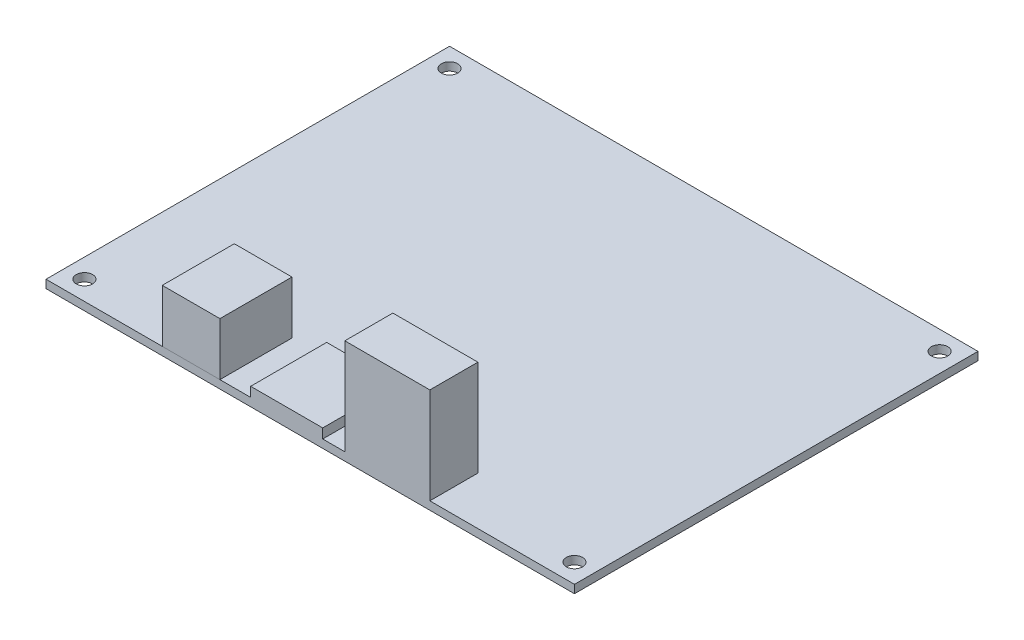
ISO-10303-21;
HEADER;
FILE_DESCRIPTION(('STEP AP214'),'2;1');
FILE_NAME('part.step','',(''),(''),'','','');
FILE_SCHEMA(('AUTOMOTIVE_DESIGN { 1 0 10303 214 1 1 1 1 }'));
ENDSEC;
DATA;
#1=APPLICATION_CONTEXT('core data for automotive mechanical design processes');
#2=APPLICATION_PROTOCOL_DEFINITION('international standard','automotive_design',2000,#1);
#3=PRODUCT_CONTEXT('',#1,'mechanical');
#4=PRODUCT('Part','Part','',(#3));
#5=PRODUCT_RELATED_PRODUCT_CATEGORY('part','',(#4));
#6=PRODUCT_DEFINITION_FORMATION('','',#4);
#7=PRODUCT_DEFINITION_CONTEXT('part definition',#1,'design');
#8=PRODUCT_DEFINITION('design','',#6,#7);
#9=PRODUCT_DEFINITION_SHAPE('','',#8);
#10=(LENGTH_UNIT() NAMED_UNIT(*) SI_UNIT(.MILLI.,.METRE.));
#11=(NAMED_UNIT(*) PLANE_ANGLE_UNIT() SI_UNIT($,.RADIAN.));
#12=(NAMED_UNIT(*) SI_UNIT($,.STERADIAN.) SOLID_ANGLE_UNIT());
#13=UNCERTAINTY_MEASURE_WITH_UNIT(LENGTH_MEASURE(1.E-05),#10,'distance_accuracy_value','');
#14=(GEOMETRIC_REPRESENTATION_CONTEXT(3) GLOBAL_UNCERTAINTY_ASSIGNED_CONTEXT((#13)) GLOBAL_UNIT_ASSIGNED_CONTEXT((#10,
#11,#12)) REPRESENTATION_CONTEXT('',''));
#15=CARTESIAN_POINT('',(0.,0.,0.));
#16=DIRECTION('',(0.,0.,1.));
#17=DIRECTION('',(1.,0.,0.));
#18=AXIS2_PLACEMENT_3D('',#15,#16,#17);
#19=CARTESIAN_POINT('',(-30.8,12.7,27.));
#20=DIRECTION('',(-1.,0.,0.));
#21=DIRECTION('',(0.,0.,1.));
#22=AXIS2_PLACEMENT_3D('',#19,#20,#21);
#23=PLANE('',#22);
#24=DIRECTION('',(0.,-1.,0.));
#25=VECTOR('',#24,1.);
#26=CARTESIAN_POINT('',(-30.8,12.7,42.));
#27=LINE('',#26,#25);
#28=CARTESIAN_POINT('',(-30.8,12.7,42.));
#29=VERTEX_POINT('',#28);
#30=CARTESIAN_POINT('',(-30.8,1.7,42.));
#31=VERTEX_POINT('',#30);
#32=EDGE_CURVE('P0_E81',#29,#31,#27,.T.);
#33=ORIENTED_EDGE('',*,*,#32,.F.);
#34=DIRECTION('',(0.,0.,1.));
#35=VECTOR('',#34,1.);
#36=CARTESIAN_POINT('',(-30.8,12.7,27.));
#37=LINE('',#36,#35);
#38=CARTESIAN_POINT('',(-30.8,12.7,27.));
#39=VERTEX_POINT('',#38);
#40=EDGE_CURVE('P0_E11',#39,#29,#37,.T.);
#41=ORIENTED_EDGE('',*,*,#40,.F.);
#42=DIRECTION('',(0.,-1.,0.));
#43=VECTOR('',#42,1.);
#44=CARTESIAN_POINT('',(-30.8,12.7,27.));
#45=LINE('',#44,#43);
#46=CARTESIAN_POINT('',(-30.8,1.7,27.));
#47=VERTEX_POINT('',#46);
#48=EDGE_CURVE('P0_E75',#39,#47,#45,.T.);
#49=ORIENTED_EDGE('',*,*,#48,.T.);
#50=DIRECTION('',(0.,0.,1.));
#51=VECTOR('',#50,1.);
#52=CARTESIAN_POINT('',(-30.8,1.7,27.));
#53=LINE('',#52,#51);
#54=EDGE_CURVE('P0_E20',#47,#31,#53,.T.);
#55=ORIENTED_EDGE('',*,*,#54,.T.);
#56=EDGE_LOOP('',(#33,#41,#49,#55));
#57=FACE_BOUND('',#56,.T.);
#58=ADVANCED_FACE('P0_F17',(#57),#23,.T.);
#59=CARTESIAN_POINT('',(-30.8,12.7,27.));
#60=DIRECTION('',(0.,1.,0.));
#61=DIRECTION('',(-1.,0.,0.));
#62=AXIS2_PLACEMENT_3D('',#59,#60,#61);
#63=PLANE('',#62);
#64=DIRECTION('',(-1.,0.,0.));
#65=VECTOR('',#64,1.);
#66=CARTESIAN_POINT('',(-30.8,12.7,42.));
#67=LINE('',#66,#65);
#68=CARTESIAN_POINT('',(-18.8,12.7,42.));
#69=VERTEX_POINT('',#68);
#70=EDGE_CURVE('P0_E77',#69,#29,#67,.T.);
#71=ORIENTED_EDGE('',*,*,#70,.F.);
#72=DIRECTION('',(0.,0.,1.));
#73=VECTOR('',#72,1.);
#74=CARTESIAN_POINT('',(-18.8,12.7,27.));
#75=LINE('',#74,#73);
#76=CARTESIAN_POINT('',(-18.8,12.7,27.));
#77=VERTEX_POINT('',#76);
#78=EDGE_CURVE('P0_E26',#77,#69,#75,.T.);
#79=ORIENTED_EDGE('',*,*,#78,.F.);
#80=DIRECTION('',(-1.,0.,0.));
#81=VECTOR('',#80,1.);
#82=CARTESIAN_POINT('',(-30.8,12.7,27.));
#83=LINE('',#82,#81);
#84=EDGE_CURVE('P0_E72',#77,#39,#83,.T.);
#85=ORIENTED_EDGE('',*,*,#84,.T.);
#86=ORIENTED_EDGE('',*,*,#40,.T.);
#87=EDGE_LOOP('',(#71,#79,#85,#86));
#88=FACE_BOUND('',#87,.T.);
#89=ADVANCED_FACE('P0_F91',(#88),#63,.T.);
#90=CARTESIAN_POINT('',(-18.8,12.7,27.));
#91=DIRECTION('',(1.,0.,0.));
#92=DIRECTION('',(0.,1.,0.));
#93=AXIS2_PLACEMENT_3D('',#90,#91,#92);
#94=PLANE('',#93);
#95=DIRECTION('',(0.,1.,0.));
#96=VECTOR('',#95,1.);
#97=CARTESIAN_POINT('',(-18.8,12.7,42.));
#98=LINE('',#97,#96);
#99=CARTESIAN_POINT('',(-18.8,1.7,42.));
#100=VERTEX_POINT('',#99);
#101=EDGE_CURVE('P0_E67',#100,#69,#98,.T.);
#102=ORIENTED_EDGE('',*,*,#101,.F.);
#103=DIRECTION('',(0.,0.,1.));
#104=VECTOR('',#103,1.);
#105=CARTESIAN_POINT('',(-18.8,1.7,27.));
#106=LINE('',#105,#104);
#107=CARTESIAN_POINT('',(-18.8,1.7,27.));
#108=VERTEX_POINT('',#107);
#109=EDGE_CURVE('P0_E62',#108,#100,#106,.T.);
#110=ORIENTED_EDGE('',*,*,#109,.F.);
#111=DIRECTION('',(0.,1.,0.));
#112=VECTOR('',#111,1.);
#113=CARTESIAN_POINT('',(-18.8,12.7,27.));
#114=LINE('',#113,#112);
#115=EDGE_CURVE('P0_E65',#108,#77,#114,.T.);
#116=ORIENTED_EDGE('',*,*,#115,.T.);
#117=ORIENTED_EDGE('',*,*,#78,.T.);
#118=EDGE_LOOP('',(#102,#110,#116,#117));
#119=FACE_BOUND('',#118,.T.);
#120=ADVANCED_FACE('P0_F64',(#119),#94,.T.);
#121=CARTESIAN_POINT('',(-30.8,1.7,27.));
#122=DIRECTION('',(0.,-1.,0.));
#123=DIRECTION('',(1.,0.,0.));
#124=AXIS2_PLACEMENT_3D('',#121,#122,#123);
#125=PLANE('',#124);
#126=DIRECTION('',(1.,0.,0.));
#127=VECTOR('',#126,1.);
#128=CARTESIAN_POINT('',(-30.8,1.7,42.));
#129=LINE('',#128,#127);
#130=EDGE_CURVE('P0_E84',#31,#100,#129,.T.);
#131=ORIENTED_EDGE('',*,*,#130,.F.);
#132=ORIENTED_EDGE('',*,*,#54,.F.);
#133=DIRECTION('',(1.,0.,0.));
#134=VECTOR('',#133,1.);
#135=CARTESIAN_POINT('',(-30.8,1.7,27.));
#136=LINE('',#135,#134);
#137=EDGE_CURVE('P0_E71',#47,#108,#136,.T.);
#138=ORIENTED_EDGE('',*,*,#137,.T.);
#139=ORIENTED_EDGE('',*,*,#109,.T.);
#140=EDGE_LOOP('',(#131,#132,#138,#139));
#141=FACE_BOUND('',#140,.T.);
#142=ADVANCED_FACE('P0_F74',(#141),#125,.T.);
#143=CARTESIAN_POINT('',(0.,0.,27.));
#144=DIRECTION('',(0.,0.,1.));
#145=DIRECTION('',(1.,0.,0.));
#146=AXIS2_PLACEMENT_3D('',#143,#144,#145);
#147=PLANE('',#146);
#148=ORIENTED_EDGE('',*,*,#48,.F.);
#149=ORIENTED_EDGE('',*,*,#84,.F.);
#150=ORIENTED_EDGE('',*,*,#115,.F.);
#151=ORIENTED_EDGE('',*,*,#137,.F.);
#152=EDGE_LOOP('',(#148,#149,#150,#151));
#153=FACE_BOUND('',#152,.T.);
#154=ADVANCED_FACE('P0_F70',(#153),#147,.F.);
#155=CARTESIAN_POINT('',(0.,0.,42.));
#156=DIRECTION('',(0.,0.,1.));
#157=DIRECTION('',(1.,0.,0.));
#158=AXIS2_PLACEMENT_3D('',#155,#156,#157);
#159=PLANE('',#158);
#160=ORIENTED_EDGE('',*,*,#32,.T.);
#161=ORIENTED_EDGE('',*,*,#130,.T.);
#162=ORIENTED_EDGE('',*,*,#101,.T.);
#163=ORIENTED_EDGE('',*,*,#70,.T.);
#164=EDGE_LOOP('',(#160,#161,#162,#163));
#165=FACE_BOUND('',#164,.T.);
#166=ADVANCED_FACE('P0_F90',(#165),#159,.T.);
#167=CLOSED_SHELL('',(#58,#89,#120,#142,#154,#166));
#168=MANIFOLD_SOLID_BREP('P0_B1',#167);
#169=CARTESIAN_POINT('',(0.,1.7,0.));
#170=DIRECTION('',(0.,1.,0.));
#171=DIRECTION('',(0.,0.,1.));
#172=AXIS2_PLACEMENT_3D('',#169,#170,#171);
#173=PLANE('',#172);
#174=CARTESIAN_POINT('',(51.,1.7,-38.));
#175=DIRECTION('',(0.,1.,0.));
#176=DIRECTION('',(0.,0.,1.));
#177=AXIS2_PLACEMENT_3D('',#174,#175,#176);
#178=CIRCLE('',#177,1.7);
#179=CARTESIAN_POINT('',(51.,1.7,-36.3));
#180=VERTEX_POINT('',#179);
#181=EDGE_CURVE('P1_E164',#180,#180,#178,.T.);
#182=ORIENTED_EDGE('',*,*,#181,.F.);
#183=EDGE_LOOP('',(#182));
#184=FACE_BOUND('',#183,.T.);
#185=CARTESIAN_POINT('',(51.,1.7,38.));
#186=DIRECTION('',(0.,1.,0.));
#187=DIRECTION('',(0.,0.,1.));
#188=AXIS2_PLACEMENT_3D('',#185,#186,#187);
#189=CIRCLE('',#188,1.7);
#190=CARTESIAN_POINT('',(51.,1.7,39.7));
#191=VERTEX_POINT('',#190);
#192=EDGE_CURVE('P1_E171',#191,#191,#189,.T.);
#193=ORIENTED_EDGE('',*,*,#192,.F.);
#194=EDGE_LOOP('',(#193));
#195=FACE_BOUND('',#194,.T.);
#196=CARTESIAN_POINT('',(-51.,1.7,38.));
#197=DIRECTION('',(0.,1.,0.));
#198=DIRECTION('',(0.,0.,1.));
#199=AXIS2_PLACEMENT_3D('',#196,#197,#198);
#200=CIRCLE('',#199,1.7);
#201=CARTESIAN_POINT('',(-51.,1.7,39.7));
#202=VERTEX_POINT('',#201);
#203=EDGE_CURVE('P1_E177',#202,#202,#200,.T.);
#204=ORIENTED_EDGE('',*,*,#203,.F.);
#205=EDGE_LOOP('',(#204));
#206=FACE_BOUND('',#205,.T.);
#207=CARTESIAN_POINT('',(-51.,1.7,-38.));
#208=DIRECTION('',(0.,1.,0.));
#209=DIRECTION('',(0.,0.,1.));
#210=AXIS2_PLACEMENT_3D('',#207,#208,#209);
#211=CIRCLE('',#210,1.7);
#212=CARTESIAN_POINT('',(-51.,1.7,-36.3));
#213=VERTEX_POINT('',#212);
#214=EDGE_CURVE('P1_E182',#213,#213,#211,.T.);
#215=ORIENTED_EDGE('',*,*,#214,.F.);
#216=EDGE_LOOP('',(#215));
#217=FACE_BOUND('',#216,.T.);
#218=DIRECTION('',(1.,0.,0.));
#219=VECTOR('',#218,1.);
#220=CARTESIAN_POINT('',(55.,1.7,42.));
#221=LINE('',#220,#219);
#222=CARTESIAN_POINT('',(-55.,1.7,42.));
#223=VERTEX_POINT('',#222);
#224=CARTESIAN_POINT('',(-12.4,1.7,42.));
#225=VERTEX_POINT('',#224);
#226=EDGE_CURVE('P1_E193',#223,#225,#221,.T.);
#227=ORIENTED_EDGE('',*,*,#226,.T.);
#228=DIRECTION('',(0.,0.,1.));
#229=VECTOR('',#228,1.);
#230=CARTESIAN_POINT('',(-12.4,1.7,42.));
#231=LINE('',#230,#229);
#232=CARTESIAN_POINT('',(-12.4,1.7,26.1752679740537));
#233=VERTEX_POINT('',#232);
#234=EDGE_CURVE('P1_E129',#233,#225,#231,.T.);
#235=ORIENTED_EDGE('',*,*,#234,.F.);
#236=DIRECTION('',(-1.,0.,0.));
#237=VECTOR('',#236,1.);
#238=CARTESIAN_POINT('',(-12.4,1.7,26.1752679740537));
#239=LINE('',#238,#237);
#240=CARTESIAN_POINT('',(2.6,1.7,26.1752679740537));
#241=VERTEX_POINT('',#240);
#242=EDGE_CURVE('P1_E125',#241,#233,#239,.T.);
#243=ORIENTED_EDGE('',*,*,#242,.F.);
#244=DIRECTION('',(0.,0.,-1.));
#245=VECTOR('',#244,1.);
#246=CARTESIAN_POINT('',(2.6,1.7,42.));
#247=LINE('',#246,#245);
#248=CARTESIAN_POINT('',(2.6,1.7,42.));
#249=VERTEX_POINT('',#248);
#250=EDGE_CURVE('P1_E235',#249,#241,#247,.T.);
#251=ORIENTED_EDGE('',*,*,#250,.F.);
#252=CARTESIAN_POINT('',(7.2,1.7,42.));
#253=VERTEX_POINT('',#252);
#254=EDGE_CURVE('P1_E196',#249,#253,#221,.T.);
#255=ORIENTED_EDGE('',*,*,#254,.T.);
#256=DIRECTION('',(0.,0.,1.));
#257=VECTOR('',#256,1.);
#258=CARTESIAN_POINT('',(7.2,1.7,32.));
#259=LINE('',#258,#257);
#260=CARTESIAN_POINT('',(7.2,1.7,32.));
#261=VERTEX_POINT('',#260);
#262=EDGE_CURVE('P1_E150',#261,#253,#259,.T.);
#263=ORIENTED_EDGE('',*,*,#262,.F.);
#264=DIRECTION('',(1.,0.,0.));
#265=VECTOR('',#264,1.);
#266=CARTESIAN_POINT('',(7.2,1.7,32.));
#267=LINE('',#266,#265);
#268=CARTESIAN_POINT('',(24.9,1.7,32.));
#269=VERTEX_POINT('',#268);
#270=EDGE_CURVE('P1_E141',#261,#269,#267,.T.);
#271=ORIENTED_EDGE('',*,*,#270,.T.);
#272=DIRECTION('',(0.,0.,1.));
#273=VECTOR('',#272,1.);
#274=CARTESIAN_POINT('',(24.9,1.7,32.));
#275=LINE('',#274,#273);
#276=CARTESIAN_POINT('',(24.9,1.7,42.));
#277=VERTEX_POINT('',#276);
#278=EDGE_CURVE('P1_E160',#269,#277,#275,.T.);
#279=ORIENTED_EDGE('',*,*,#278,.T.);
#280=CARTESIAN_POINT('',(55.,1.7,42.));
#281=VERTEX_POINT('',#280);
#282=EDGE_CURVE('P1_E191',#277,#281,#221,.T.);
#283=ORIENTED_EDGE('',*,*,#282,.T.);
#284=DIRECTION('',(0.,0.,-1.));
#285=VECTOR('',#284,1.);
#286=CARTESIAN_POINT('',(55.,1.7,42.));
#287=LINE('',#286,#285);
#288=CARTESIAN_POINT('',(55.,1.7,-42.));
#289=VERTEX_POINT('',#288);
#290=EDGE_CURVE('P1_E195',#281,#289,#287,.T.);
#291=ORIENTED_EDGE('',*,*,#290,.T.);
#292=DIRECTION('',(-1.,0.,0.));
#293=VECTOR('',#292,1.);
#294=CARTESIAN_POINT('',(55.,1.7,-42.));
#295=LINE('',#294,#293);
#296=CARTESIAN_POINT('',(-55.,1.7,-42.));
#297=VERTEX_POINT('',#296);
#298=EDGE_CURVE('P1_E198',#289,#297,#295,.T.);
#299=ORIENTED_EDGE('',*,*,#298,.T.);
#300=DIRECTION('',(0.,0.,1.));
#301=VECTOR('',#300,1.);
#302=CARTESIAN_POINT('',(-55.,1.7,42.));
#303=LINE('',#302,#301);
#304=EDGE_CURVE('P1_E188',#297,#223,#303,.T.);
#305=ORIENTED_EDGE('',*,*,#304,.T.);
#306=EDGE_LOOP('',(#227,#235,#243,#251,#255,#263,#271,#279,#283,#291,#299,#305));
#307=FACE_BOUND('',#306,.T.);
#308=ADVANCED_FACE('P1_F17',(#184,#195,#206,#217,#307),#173,.T.);
#309=CARTESIAN_POINT('',(-55.,1.7,42.));
#310=DIRECTION('',(1.,0.,0.));
#311=DIRECTION('',(0.,0.,-1.));
#312=AXIS2_PLACEMENT_3D('',#309,#310,#311);
#313=PLANE('',#312);
#314=DIRECTION('',(0.,0.,1.));
#315=VECTOR('',#314,1.);
#316=CARTESIAN_POINT('',(-55.,0.,42.));
#317=LINE('',#316,#315);
#318=CARTESIAN_POINT('',(-55.,0.,-42.));
#319=VERTEX_POINT('',#318);
#320=CARTESIAN_POINT('',(-55.,0.,42.));
#321=VERTEX_POINT('',#320);
#322=EDGE_CURVE('P1_E185',#319,#321,#317,.T.);
#323=ORIENTED_EDGE('',*,*,#322,.T.);
#324=DIRECTION('',(0.,-1.,0.));
#325=VECTOR('',#324,1.);
#326=CARTESIAN_POINT('',(-55.,1.7,42.));
#327=LINE('',#326,#325);
#328=EDGE_CURVE('P1_E11',#223,#321,#327,.T.);
#329=ORIENTED_EDGE('',*,*,#328,.F.);
#330=ORIENTED_EDGE('',*,*,#304,.F.);
#331=DIRECTION('',(0.,-1.,0.));
#332=VECTOR('',#331,1.);
#333=CARTESIAN_POINT('',(-55.,1.7,-42.));
#334=LINE('',#333,#332);
#335=EDGE_CURVE('P1_E200',#297,#319,#334,.T.);
#336=ORIENTED_EDGE('',*,*,#335,.T.);
#337=EDGE_LOOP('',(#323,#329,#330,#336));
#338=FACE_BOUND('',#337,.T.);
#339=ADVANCED_FACE('P1_F19',(#338),#313,.F.);
#340=CARTESIAN_POINT('',(55.,1.7,42.));
#341=DIRECTION('',(0.,0.,-1.));
#342=DIRECTION('',(-1.,0.,0.));
#343=AXIS2_PLACEMENT_3D('',#340,#341,#342);
#344=PLANE('',#343);
#345=DIRECTION('',(1.,0.,0.));
#346=VECTOR('',#345,1.);
#347=CARTESIAN_POINT('',(55.,0.,42.));
#348=LINE('',#347,#346);
#349=CARTESIAN_POINT('',(55.,0.,42.));
#350=VERTEX_POINT('',#349);
#351=EDGE_CURVE('P1_E203',#321,#350,#348,.T.);
#352=ORIENTED_EDGE('',*,*,#351,.T.);
#353=DIRECTION('',(0.,-1.,0.));
#354=VECTOR('',#353,1.);
#355=CARTESIAN_POINT('',(55.,1.7,42.));
#356=LINE('',#355,#354);
#357=EDGE_CURVE('P1_E25',#281,#350,#356,.T.);
#358=ORIENTED_EDGE('',*,*,#357,.F.);
#359=ORIENTED_EDGE('',*,*,#282,.F.);
#360=DIRECTION('',(0.,1.,0.));
#361=VECTOR('',#360,1.);
#362=CARTESIAN_POINT('',(24.9,1.7,42.));
#363=LINE('',#362,#361);
#364=CARTESIAN_POINT('',(24.9,21.7,42.));
#365=VERTEX_POINT('',#364);
#366=EDGE_CURVE('P1_E40',#277,#365,#363,.T.);
#367=ORIENTED_EDGE('',*,*,#366,.T.);
#368=DIRECTION('',(-1.,0.,0.));
#369=VECTOR('',#368,1.);
#370=CARTESIAN_POINT('',(7.2,21.7,42.));
#371=LINE('',#370,#369);
#372=CARTESIAN_POINT('',(7.2,21.7,42.));
#373=VERTEX_POINT('',#372);
#374=EDGE_CURVE('P1_E142',#365,#373,#371,.T.);
#375=ORIENTED_EDGE('',*,*,#374,.T.);
#376=DIRECTION('',(0.,-1.,0.));
#377=VECTOR('',#376,1.);
#378=CARTESIAN_POINT('',(7.2,1.7,42.));
#379=LINE('',#378,#377);
#380=EDGE_CURVE('P1_E131',#373,#253,#379,.T.);
#381=ORIENTED_EDGE('',*,*,#380,.T.);
#382=ORIENTED_EDGE('',*,*,#254,.F.);
#383=DIRECTION('',(0.,-1.,0.));
#384=VECTOR('',#383,1.);
#385=CARTESIAN_POINT('',(2.6,3.7,42.));
#386=LINE('',#385,#384);
#387=CARTESIAN_POINT('',(2.6,3.7,42.));
#388=VERTEX_POINT('',#387);
#389=EDGE_CURVE('P1_E113',#388,#249,#386,.T.);
#390=ORIENTED_EDGE('',*,*,#389,.F.);
#391=DIRECTION('',(1.,0.,0.));
#392=VECTOR('',#391,1.);
#393=CARTESIAN_POINT('',(-12.4,3.7,42.));
#394=LINE('',#393,#392);
#395=CARTESIAN_POINT('',(-12.4,3.7,42.));
#396=VERTEX_POINT('',#395);
#397=EDGE_CURVE('P1_E106',#396,#388,#394,.T.);
#398=ORIENTED_EDGE('',*,*,#397,.F.);
#399=DIRECTION('',(0.,-1.,0.));
#400=VECTOR('',#399,1.);
#401=CARTESIAN_POINT('',(-12.4,3.7,42.));
#402=LINE('',#401,#400);
#403=EDGE_CURVE('P1_E110',#396,#225,#402,.T.);
#404=ORIENTED_EDGE('',*,*,#403,.T.);
#405=ORIENTED_EDGE('',*,*,#226,.F.);
#406=ORIENTED_EDGE('',*,*,#328,.T.);
#407=EDGE_LOOP('',(#352,#358,#359,#367,#375,#381,#382,#390,#398,#404,#405,#406));
#408=FACE_BOUND('',#407,.T.);
#409=ADVANCED_FACE('P1_F108',(#408),#344,.F.);
#410=CARTESIAN_POINT('',(55.,1.7,42.));
#411=DIRECTION('',(-1.,0.,0.));
#412=DIRECTION('',(0.,0.,1.));
#413=AXIS2_PLACEMENT_3D('',#410,#411,#412);
#414=PLANE('',#413);
#415=DIRECTION('',(0.,0.,-1.));
#416=VECTOR('',#415,1.);
#417=CARTESIAN_POINT('',(55.,0.,42.));
#418=LINE('',#417,#416);
#419=CARTESIAN_POINT('',(55.,0.,-42.));
#420=VERTEX_POINT('',#419);
#421=EDGE_CURVE('P1_E205',#350,#420,#418,.T.);
#422=ORIENTED_EDGE('',*,*,#421,.T.);
#423=DIRECTION('',(0.,-1.,0.));
#424=VECTOR('',#423,1.);
#425=CARTESIAN_POINT('',(55.,1.7,-42.));
#426=LINE('',#425,#424);
#427=EDGE_CURVE('P1_E210',#289,#420,#426,.T.);
#428=ORIENTED_EDGE('',*,*,#427,.F.);
#429=ORIENTED_EDGE('',*,*,#290,.F.);
#430=ORIENTED_EDGE('',*,*,#357,.T.);
#431=EDGE_LOOP('',(#422,#428,#429,#430));
#432=FACE_BOUND('',#431,.T.);
#433=ADVANCED_FACE('P1_F217',(#432),#414,.F.);
#434=CARTESIAN_POINT('',(55.,1.7,-42.));
#435=DIRECTION('',(0.,0.,1.));
#436=DIRECTION('',(1.,0.,0.));
#437=AXIS2_PLACEMENT_3D('',#434,#435,#436);
#438=PLANE('',#437);
#439=DIRECTION('',(-1.,0.,0.));
#440=VECTOR('',#439,1.);
#441=CARTESIAN_POINT('',(55.,0.,-42.));
#442=LINE('',#441,#440);
#443=EDGE_CURVE('P1_E192',#420,#319,#442,.T.);
#444=ORIENTED_EDGE('',*,*,#443,.T.);
#445=ORIENTED_EDGE('',*,*,#335,.F.);
#446=ORIENTED_EDGE('',*,*,#298,.F.);
#447=ORIENTED_EDGE('',*,*,#427,.T.);
#448=EDGE_LOOP('',(#444,#445,#446,#447));
#449=FACE_BOUND('',#448,.T.);
#450=ADVANCED_FACE('P1_F226',(#449),#438,.F.);
#451=CARTESIAN_POINT('',(0.,0.,0.));
#452=DIRECTION('',(0.,1.,0.));
#453=DIRECTION('',(0.,0.,1.));
#454=AXIS2_PLACEMENT_3D('',#451,#452,#453);
#455=PLANE('',#454);
#456=CARTESIAN_POINT('',(51.,0.,-38.));
#457=DIRECTION('',(0.,1.,0.));
#458=DIRECTION('',(0.,0.,1.));
#459=AXIS2_PLACEMENT_3D('',#456,#457,#458);
#460=CIRCLE('',#459,1.7);
#461=CARTESIAN_POINT('',(51.,0.,-36.3));
#462=VERTEX_POINT('',#461);
#463=EDGE_CURVE('P1_E168',#462,#462,#460,.T.);
#464=ORIENTED_EDGE('',*,*,#463,.T.);
#465=EDGE_LOOP('',(#464));
#466=FACE_BOUND('',#465,.T.);
#467=CARTESIAN_POINT('',(51.,0.,38.));
#468=DIRECTION('',(0.,1.,0.));
#469=DIRECTION('',(0.,0.,1.));
#470=AXIS2_PLACEMENT_3D('',#467,#468,#469);
#471=CIRCLE('',#470,1.7);
#472=CARTESIAN_POINT('',(51.,0.,39.7));
#473=VERTEX_POINT('',#472);
#474=EDGE_CURVE('P1_E174',#473,#473,#471,.T.);
#475=ORIENTED_EDGE('',*,*,#474,.T.);
#476=EDGE_LOOP('',(#475));
#477=FACE_BOUND('',#476,.T.);
#478=CARTESIAN_POINT('',(-51.,0.,38.));
#479=DIRECTION('',(0.,1.,0.));
#480=DIRECTION('',(0.,0.,1.));
#481=AXIS2_PLACEMENT_3D('',#478,#479,#480);
#482=CIRCLE('',#481,1.7);
#483=CARTESIAN_POINT('',(-51.,0.,39.7));
#484=VERTEX_POINT('',#483);
#485=EDGE_CURVE('P1_E157',#484,#484,#482,.T.);
#486=ORIENTED_EDGE('',*,*,#485,.T.);
#487=EDGE_LOOP('',(#486));
#488=FACE_BOUND('',#487,.T.);
#489=CARTESIAN_POINT('',(-51.,0.,-38.));
#490=DIRECTION('',(0.,1.,0.));
#491=DIRECTION('',(0.,0.,1.));
#492=AXIS2_PLACEMENT_3D('',#489,#490,#491);
#493=CIRCLE('',#492,1.7);
#494=CARTESIAN_POINT('',(-51.,0.,-36.3));
#495=VERTEX_POINT('',#494);
#496=EDGE_CURVE('P1_E167',#495,#495,#493,.T.);
#497=ORIENTED_EDGE('',*,*,#496,.T.);
#498=EDGE_LOOP('',(#497));
#499=FACE_BOUND('',#498,.T.);
#500=ORIENTED_EDGE('',*,*,#322,.F.);
#501=ORIENTED_EDGE('',*,*,#443,.F.);
#502=ORIENTED_EDGE('',*,*,#421,.F.);
#503=ORIENTED_EDGE('',*,*,#351,.F.);
#504=EDGE_LOOP('',(#500,#501,#502,#503));
#505=FACE_BOUND('',#504,.T.);
#506=ADVANCED_FACE('P1_F223',(#466,#477,#488,#499,#505),#455,.F.);
#507=CARTESIAN_POINT('',(-51.,1.7,-38.));
#508=DIRECTION('',(0.,-1.,0.));
#509=DIRECTION('',(0.,0.,-1.));
#510=AXIS2_PLACEMENT_3D('',#507,#508,#509);
#511=CYLINDRICAL_SURFACE('',#510,1.7);
#512=ORIENTED_EDGE('',*,*,#214,.T.);
#513=EDGE_LOOP('',(#512));
#514=FACE_BOUND('',#513,.T.);
#515=ORIENTED_EDGE('',*,*,#496,.F.);
#516=EDGE_LOOP('',(#515));
#517=FACE_BOUND('',#516,.T.);
#518=ADVANCED_FACE('P1_F270',(#514,#517),#511,.F.);
#519=CARTESIAN_POINT('',(-51.,1.7,38.));
#520=DIRECTION('',(0.,-1.,0.));
#521=DIRECTION('',(0.,0.,-1.));
#522=AXIS2_PLACEMENT_3D('',#519,#520,#521);
#523=CYLINDRICAL_SURFACE('',#522,1.7);
#524=ORIENTED_EDGE('',*,*,#203,.T.);
#525=EDGE_LOOP('',(#524));
#526=FACE_BOUND('',#525,.T.);
#527=ORIENTED_EDGE('',*,*,#485,.F.);
#528=EDGE_LOOP('',(#527));
#529=FACE_BOUND('',#528,.T.);
#530=ADVANCED_FACE('P1_F310',(#526,#529),#523,.F.);
#531=CARTESIAN_POINT('',(51.,1.7,38.));
#532=DIRECTION('',(0.,-1.,0.));
#533=DIRECTION('',(0.,0.,-1.));
#534=AXIS2_PLACEMENT_3D('',#531,#532,#533);
#535=CYLINDRICAL_SURFACE('',#534,1.7);
#536=ORIENTED_EDGE('',*,*,#192,.T.);
#537=EDGE_LOOP('',(#536));
#538=FACE_BOUND('',#537,.T.);
#539=ORIENTED_EDGE('',*,*,#474,.F.);
#540=EDGE_LOOP('',(#539));
#541=FACE_BOUND('',#540,.T.);
#542=ADVANCED_FACE('P1_F318',(#538,#541),#535,.F.);
#543=CARTESIAN_POINT('',(51.,1.7,-38.));
#544=DIRECTION('',(0.,-1.,0.));
#545=DIRECTION('',(0.,0.,-1.));
#546=AXIS2_PLACEMENT_3D('',#543,#544,#545);
#547=CYLINDRICAL_SURFACE('',#546,1.7);
#548=ORIENTED_EDGE('',*,*,#181,.T.);
#549=EDGE_LOOP('',(#548));
#550=FACE_BOUND('',#549,.T.);
#551=ORIENTED_EDGE('',*,*,#463,.F.);
#552=EDGE_LOOP('',(#551));
#553=FACE_BOUND('',#552,.T.);
#554=ADVANCED_FACE('P1_F326',(#550,#553),#547,.F.);
#555=CARTESIAN_POINT('',(7.2,1.7,32.));
#556=DIRECTION('',(-1.,0.,0.));
#557=DIRECTION('',(0.,-1.,0.));
#558=AXIS2_PLACEMENT_3D('',#555,#556,#557);
#559=PLANE('',#558);
#560=ORIENTED_EDGE('',*,*,#380,.F.);
#561=DIRECTION('',(0.,0.,1.));
#562=VECTOR('',#561,1.);
#563=CARTESIAN_POINT('',(7.2,21.7,32.));
#564=LINE('',#563,#562);
#565=CARTESIAN_POINT('',(7.2,21.7,32.));
#566=VERTEX_POINT('',#565);
#567=EDGE_CURVE('P1_E155',#566,#373,#564,.T.);
#568=ORIENTED_EDGE('',*,*,#567,.F.);
#569=DIRECTION('',(0.,-1.,0.));
#570=VECTOR('',#569,1.);
#571=CARTESIAN_POINT('',(7.2,1.7,32.));
#572=LINE('',#571,#570);
#573=EDGE_CURVE('P1_E138',#566,#261,#572,.T.);
#574=ORIENTED_EDGE('',*,*,#573,.T.);
#575=ORIENTED_EDGE('',*,*,#262,.T.);
#576=EDGE_LOOP('',(#560,#568,#574,#575));
#577=FACE_BOUND('',#576,.T.);
#578=ADVANCED_FACE('P1_F238',(#577),#559,.T.);
#579=CARTESIAN_POINT('',(7.2,21.7,32.));
#580=DIRECTION('',(0.,1.,0.));
#581=DIRECTION('',(0.,0.,1.));
#582=AXIS2_PLACEMENT_3D('',#579,#580,#581);
#583=PLANE('',#582);
#584=ORIENTED_EDGE('',*,*,#374,.F.);
#585=DIRECTION('',(0.,0.,1.));
#586=VECTOR('',#585,1.);
#587=CARTESIAN_POINT('',(24.9,21.7,32.));
#588=LINE('',#587,#586);
#589=CARTESIAN_POINT('',(24.9,21.7,32.));
#590=VERTEX_POINT('',#589);
#591=EDGE_CURVE('P1_E158',#590,#365,#588,.T.);
#592=ORIENTED_EDGE('',*,*,#591,.F.);
#593=DIRECTION('',(-1.,0.,0.));
#594=VECTOR('',#593,1.);
#595=CARTESIAN_POINT('',(7.2,21.7,32.));
#596=LINE('',#595,#594);
#597=EDGE_CURVE('P1_E148',#590,#566,#596,.T.);
#598=ORIENTED_EDGE('',*,*,#597,.T.);
#599=ORIENTED_EDGE('',*,*,#567,.T.);
#600=EDGE_LOOP('',(#584,#592,#598,#599));
#601=FACE_BOUND('',#600,.T.);
#602=ADVANCED_FACE('P1_F242',(#601),#583,.T.);
#603=CARTESIAN_POINT('',(24.9,1.7,32.));
#604=DIRECTION('',(1.,0.,0.));
#605=DIRECTION('',(0.,0.,-1.));
#606=AXIS2_PLACEMENT_3D('',#603,#604,#605);
#607=PLANE('',#606);
#608=ORIENTED_EDGE('',*,*,#366,.F.);
#609=ORIENTED_EDGE('',*,*,#278,.F.);
#610=DIRECTION('',(0.,1.,0.));
#611=VECTOR('',#610,1.);
#612=CARTESIAN_POINT('',(24.9,1.7,32.));
#613=LINE('',#612,#611);
#614=EDGE_CURVE('P1_E145',#269,#590,#613,.T.);
#615=ORIENTED_EDGE('',*,*,#614,.T.);
#616=ORIENTED_EDGE('',*,*,#591,.T.);
#617=EDGE_LOOP('',(#608,#609,#615,#616));
#618=FACE_BOUND('',#617,.T.);
#619=ADVANCED_FACE('P1_F247',(#618),#607,.T.);
#620=CARTESIAN_POINT('',(0.,0.,32.));
#621=DIRECTION('',(0.,0.,-1.));
#622=DIRECTION('',(-1.,0.,0.));
#623=AXIS2_PLACEMENT_3D('',#620,#621,#622);
#624=PLANE('',#623);
#625=ORIENTED_EDGE('',*,*,#573,.F.);
#626=ORIENTED_EDGE('',*,*,#597,.F.);
#627=ORIENTED_EDGE('',*,*,#614,.F.);
#628=ORIENTED_EDGE('',*,*,#270,.F.);
#629=EDGE_LOOP('',(#625,#626,#627,#628));
#630=FACE_BOUND('',#629,.T.);
#631=ADVANCED_FACE('P1_F245',(#630),#624,.T.);
#632=CARTESIAN_POINT('',(-12.4,3.7,42.));
#633=DIRECTION('',(1.,0.,0.));
#634=DIRECTION('',(0.,0.,-1.));
#635=AXIS2_PLACEMENT_3D('',#632,#633,#634);
#636=PLANE('',#635);
#637=ORIENTED_EDGE('',*,*,#234,.T.);
#638=ORIENTED_EDGE('',*,*,#403,.F.);
#639=DIRECTION('',(0.,0.,1.));
#640=VECTOR('',#639,1.);
#641=CARTESIAN_POINT('',(-12.4,3.7,42.));
#642=LINE('',#641,#640);
#643=CARTESIAN_POINT('',(-12.4,3.7,26.1752679740537));
#644=VERTEX_POINT('',#643);
#645=EDGE_CURVE('P1_E117',#644,#396,#642,.T.);
#646=ORIENTED_EDGE('',*,*,#645,.F.);
#647=DIRECTION('',(0.,-1.,0.));
#648=VECTOR('',#647,1.);
#649=CARTESIAN_POINT('',(-12.4,3.7,26.1752679740537));
#650=LINE('',#649,#648);
#651=EDGE_CURVE('P1_E399',#644,#233,#650,.T.);
#652=ORIENTED_EDGE('',*,*,#651,.T.);
#653=EDGE_LOOP('',(#637,#638,#646,#652));
#654=FACE_BOUND('',#653,.T.);
#655=ADVANCED_FACE('P1_F127',(#654),#636,.F.);
#656=CARTESIAN_POINT('',(2.6,3.7,42.));
#657=DIRECTION('',(-1.,0.,0.));
#658=DIRECTION('',(0.,0.,1.));
#659=AXIS2_PLACEMENT_3D('',#656,#657,#658);
#660=PLANE('',#659);
#661=ORIENTED_EDGE('',*,*,#250,.T.);
#662=DIRECTION('',(0.,-1.,0.));
#663=VECTOR('',#662,1.);
#664=CARTESIAN_POINT('',(2.6,3.7,26.1752679740537));
#665=LINE('',#664,#663);
#666=CARTESIAN_POINT('',(2.6,3.7,26.1752679740537));
#667=VERTEX_POINT('',#666);
#668=EDGE_CURVE('P1_E32',#667,#241,#665,.T.);
#669=ORIENTED_EDGE('',*,*,#668,.F.);
#670=DIRECTION('',(0.,0.,-1.));
#671=VECTOR('',#670,1.);
#672=CARTESIAN_POINT('',(2.6,3.7,42.));
#673=LINE('',#672,#671);
#674=EDGE_CURVE('P1_E116',#388,#667,#673,.T.);
#675=ORIENTED_EDGE('',*,*,#674,.F.);
#676=ORIENTED_EDGE('',*,*,#389,.T.);
#677=EDGE_LOOP('',(#661,#669,#675,#676));
#678=FACE_BOUND('',#677,.T.);
#679=ADVANCED_FACE('P1_F367',(#678),#660,.F.);
#680=CARTESIAN_POINT('',(-12.4,3.7,26.1752679740537));
#681=DIRECTION('',(0.,0.,1.));
#682=DIRECTION('',(1.,0.,0.));
#683=AXIS2_PLACEMENT_3D('',#680,#681,#682);
#684=PLANE('',#683);
#685=ORIENTED_EDGE('',*,*,#242,.T.);
#686=ORIENTED_EDGE('',*,*,#651,.F.);
#687=DIRECTION('',(-1.,0.,0.));
#688=VECTOR('',#687,1.);
#689=CARTESIAN_POINT('',(-12.4,3.7,26.1752679740537));
#690=LINE('',#689,#688);
#691=EDGE_CURVE('P1_E121',#667,#644,#690,.T.);
#692=ORIENTED_EDGE('',*,*,#691,.F.);
#693=ORIENTED_EDGE('',*,*,#668,.T.);
#694=EDGE_LOOP('',(#685,#686,#692,#693));
#695=FACE_BOUND('',#694,.T.);
#696=ADVANCED_FACE('P1_F376',(#695),#684,.F.);
#697=CARTESIAN_POINT('',(0.,3.7,0.));
#698=DIRECTION('',(0.,-1.,0.));
#699=DIRECTION('',(0.,0.,-1.));
#700=AXIS2_PLACEMENT_3D('',#697,#698,#699);
#701=PLANE('',#700);
#702=ORIENTED_EDGE('',*,*,#645,.T.);
#703=ORIENTED_EDGE('',*,*,#397,.T.);
#704=ORIENTED_EDGE('',*,*,#674,.T.);
#705=ORIENTED_EDGE('',*,*,#691,.T.);
#706=EDGE_LOOP('',(#702,#703,#704,#705));
#707=FACE_BOUND('',#706,.T.);
#708=ADVANCED_FACE('P1_F120',(#707),#701,.F.);
#709=CLOSED_SHELL('',(#308,#339,#409,#433,#450,#506,#518,#530,#542,#554,#578,#602,#619,#631,
#655,#679,#696,#708));
#710=MANIFOLD_SOLID_BREP('P1_B1',#709);
#711=ADVANCED_BREP_SHAPE_REPRESENTATION('',(#18,#168,#710),#14);
#712=SHAPE_DEFINITION_REPRESENTATION(#9,#711);
ENDSEC;
END-ISO-10303-21;
